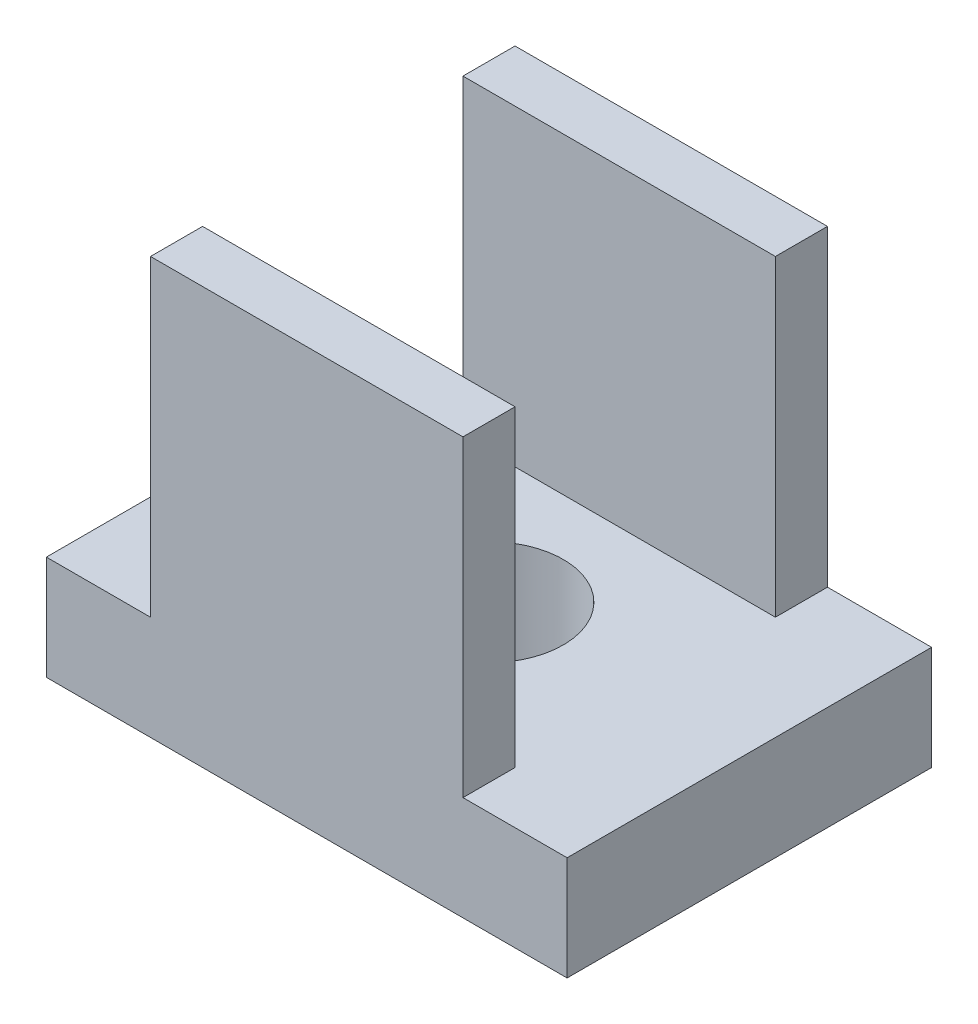
ISO-10303-21;
HEADER;
FILE_DESCRIPTION(('STEP AP214'),'2;1');
FILE_NAME('part.step','',(''),(''),'','','');
FILE_SCHEMA(('AUTOMOTIVE_DESIGN { 1 0 10303 214 1 1 1 1 }'));
ENDSEC;
DATA;
#1=APPLICATION_CONTEXT('core data for automotive mechanical design processes');
#2=APPLICATION_PROTOCOL_DEFINITION('international standard','automotive_design',2000,#1);
#3=PRODUCT_CONTEXT('',#1,'mechanical');
#4=PRODUCT('Part','Part','',(#3));
#5=PRODUCT_RELATED_PRODUCT_CATEGORY('part','',(#4));
#6=PRODUCT_DEFINITION_FORMATION('','',#4);
#7=PRODUCT_DEFINITION_CONTEXT('part definition',#1,'design');
#8=PRODUCT_DEFINITION('design','',#6,#7);
#9=PRODUCT_DEFINITION_SHAPE('','',#8);
#10=(LENGTH_UNIT() NAMED_UNIT(*) SI_UNIT(.MILLI.,.METRE.));
#11=(NAMED_UNIT(*) PLANE_ANGLE_UNIT() SI_UNIT($,.RADIAN.));
#12=(NAMED_UNIT(*) SI_UNIT($,.STERADIAN.) SOLID_ANGLE_UNIT());
#13=UNCERTAINTY_MEASURE_WITH_UNIT(LENGTH_MEASURE(1.E-05),#10,'distance_accuracy_value','');
#14=(GEOMETRIC_REPRESENTATION_CONTEXT(3) GLOBAL_UNCERTAINTY_ASSIGNED_CONTEXT((#13)) GLOBAL_UNIT_ASSIGNED_CONTEXT((#10,
#11,#12)) REPRESENTATION_CONTEXT('',''));
#15=CARTESIAN_POINT('',(0.,0.,0.));
#16=DIRECTION('',(0.,0.,1.));
#17=DIRECTION('',(1.,0.,0.));
#18=AXIS2_PLACEMENT_3D('',#15,#16,#17);
#19=CARTESIAN_POINT('',(0.,2.,0.));
#20=DIRECTION('',(0.,-1.,0.));
#21=DIRECTION('',(0.,0.,-1.));
#22=AXIS2_PLACEMENT_3D('',#19,#20,#21);
#23=PLANE('',#22);
#24=CARTESIAN_POINT('',(0.,2.,0.));
#25=DIRECTION('',(0.,1.,0.));
#26=DIRECTION('',(0.,0.,1.));
#27=AXIS2_PLACEMENT_3D('',#24,#25,#26);
#28=CIRCLE('',#27,1.425);
#29=CARTESIAN_POINT('',(0.,2.,1.425));
#30=VERTEX_POINT('',#29);
#31=EDGE_CURVE('E200',#30,#30,#28,.T.);
#32=ORIENTED_EDGE('',*,*,#31,.F.);
#33=EDGE_LOOP('',(#32));
#34=FACE_BOUND('',#33,.T.);
#35=DIRECTION('',(0.,0.,-1.));
#36=VECTOR('',#35,1.);
#37=CARTESIAN_POINT('',(3.,2.,-3.5));
#38=LINE('',#37,#36);
#39=CARTESIAN_POINT('',(3.,2.,-2.5));
#40=VERTEX_POINT('',#39);
#41=CARTESIAN_POINT('',(3.,2.,-3.5));
#42=VERTEX_POINT('',#41);
#43=EDGE_CURVE('E56',#40,#42,#38,.T.);
#44=ORIENTED_EDGE('',*,*,#43,.F.);
#45=DIRECTION('',(1.,0.,0.));
#46=VECTOR('',#45,1.);
#47=CARTESIAN_POINT('',(3.,2.,-2.5));
#48=LINE('',#47,#46);
#49=CARTESIAN_POINT('',(-3.,2.,-2.5));
#50=VERTEX_POINT('',#49);
#51=EDGE_CURVE('E60',#50,#40,#48,.T.);
#52=ORIENTED_EDGE('',*,*,#51,.F.);
#53=DIRECTION('',(0.,0.,1.));
#54=VECTOR('',#53,1.);
#55=CARTESIAN_POINT('',(-3.,2.,-3.5));
#56=LINE('',#55,#54);
#57=CARTESIAN_POINT('',(-3.,2.,-3.5));
#58=VERTEX_POINT('',#57);
#59=EDGE_CURVE('E412',#58,#50,#56,.T.);
#60=ORIENTED_EDGE('',*,*,#59,.F.);
#61=DIRECTION('',(-1.,0.,0.));
#62=VECTOR('',#61,1.);
#63=CARTESIAN_POINT('',(-5.,2.,-3.5));
#64=LINE('',#63,#62);
#65=CARTESIAN_POINT('',(-5.,2.,-3.5));
#66=VERTEX_POINT('',#65);
#67=EDGE_CURVE('E208',#58,#66,#64,.T.);
#68=ORIENTED_EDGE('',*,*,#67,.T.);
#69=DIRECTION('',(0.,0.,1.));
#70=VECTOR('',#69,1.);
#71=CARTESIAN_POINT('',(-5.,2.,3.5));
#72=LINE('',#71,#70);
#73=CARTESIAN_POINT('',(-5.,2.,3.5));
#74=VERTEX_POINT('',#73);
#75=EDGE_CURVE('E213',#66,#74,#72,.T.);
#76=ORIENTED_EDGE('',*,*,#75,.T.);
#77=DIRECTION('',(1.,0.,0.));
#78=VECTOR('',#77,1.);
#79=CARTESIAN_POINT('',(-5.,2.,3.5));
#80=LINE('',#79,#78);
#81=CARTESIAN_POINT('',(-3.,2.,3.5));
#82=VERTEX_POINT('',#81);
#83=EDGE_CURVE('E217',#74,#82,#80,.T.);
#84=ORIENTED_EDGE('',*,*,#83,.T.);
#85=DIRECTION('',(0.,0.,1.));
#86=VECTOR('',#85,1.);
#87=CARTESIAN_POINT('',(-3.,2.,3.5));
#88=LINE('',#87,#86);
#89=CARTESIAN_POINT('',(-3.,2.,2.5));
#90=VERTEX_POINT('',#89);
#91=EDGE_CURVE('E169',#90,#82,#88,.T.);
#92=ORIENTED_EDGE('',*,*,#91,.F.);
#93=DIRECTION('',(-1.,0.,0.));
#94=VECTOR('',#93,1.);
#95=CARTESIAN_POINT('',(3.,2.,2.5));
#96=LINE('',#95,#94);
#97=CARTESIAN_POINT('',(3.,2.,2.5));
#98=VERTEX_POINT('',#97);
#99=EDGE_CURVE('E158',#98,#90,#96,.T.);
#100=ORIENTED_EDGE('',*,*,#99,.F.);
#101=DIRECTION('',(0.,0.,-1.));
#102=VECTOR('',#101,1.);
#103=CARTESIAN_POINT('',(3.,2.,3.5));
#104=LINE('',#103,#102);
#105=CARTESIAN_POINT('',(3.,2.,3.5));
#106=VERTEX_POINT('',#105);
#107=EDGE_CURVE('E153',#106,#98,#104,.T.);
#108=ORIENTED_EDGE('',*,*,#107,.F.);
#109=CARTESIAN_POINT('',(5.,2.,3.5));
#110=VERTEX_POINT('',#109);
#111=EDGE_CURVE('E216',#106,#110,#80,.T.);
#112=ORIENTED_EDGE('',*,*,#111,.T.);
#113=DIRECTION('',(0.,0.,-1.));
#114=VECTOR('',#113,1.);
#115=CARTESIAN_POINT('',(5.,2.,3.5));
#116=LINE('',#115,#114);
#117=CARTESIAN_POINT('',(5.,2.,-3.5));
#118=VERTEX_POINT('',#117);
#119=EDGE_CURVE('E204',#110,#118,#116,.T.);
#120=ORIENTED_EDGE('',*,*,#119,.T.);
#121=EDGE_CURVE('E210',#118,#42,#64,.T.);
#122=ORIENTED_EDGE('',*,*,#121,.T.);
#123=EDGE_LOOP('',(#44,#52,#60,#68,#76,#84,#92,#100,#108,#112,#120,#122));
#124=FACE_BOUND('',#123,.T.);
#125=ADVANCED_FACE('F39',(#34,#124),#23,.F.);
#126=CARTESIAN_POINT('',(5.,2.,3.5));
#127=DIRECTION('',(-1.,0.,0.));
#128=DIRECTION('',(0.,0.,1.));
#129=AXIS2_PLACEMENT_3D('',#126,#127,#128);
#130=PLANE('',#129);
#131=DIRECTION('',(0.,0.,-1.));
#132=VECTOR('',#131,1.);
#133=CARTESIAN_POINT('',(5.,0.,3.5));
#134=LINE('',#133,#132);
#135=CARTESIAN_POINT('',(5.,0.,3.5));
#136=VERTEX_POINT('',#135);
#137=CARTESIAN_POINT('',(5.,0.,-3.5));
#138=VERTEX_POINT('',#137);
#139=EDGE_CURVE('E221',#136,#138,#134,.T.);
#140=ORIENTED_EDGE('',*,*,#139,.T.);
#141=DIRECTION('',(0.,-1.,0.));
#142=VECTOR('',#141,1.);
#143=CARTESIAN_POINT('',(5.,2.,-3.5));
#144=LINE('',#143,#142);
#145=EDGE_CURVE('E11',#118,#138,#144,.T.);
#146=ORIENTED_EDGE('',*,*,#145,.F.);
#147=ORIENTED_EDGE('',*,*,#119,.F.);
#148=DIRECTION('',(0.,-1.,0.));
#149=VECTOR('',#148,1.);
#150=CARTESIAN_POINT('',(5.,2.,3.5));
#151=LINE('',#150,#149);
#152=EDGE_CURVE('E220',#110,#136,#151,.T.);
#153=ORIENTED_EDGE('',*,*,#152,.T.);
#154=EDGE_LOOP('',(#140,#146,#147,#153));
#155=FACE_BOUND('',#154,.T.);
#156=ADVANCED_FACE('F41',(#155),#130,.F.);
#157=CARTESIAN_POINT('',(-5.,2.,-3.5));
#158=DIRECTION('',(0.,0.,1.));
#159=DIRECTION('',(1.,0.,0.));
#160=AXIS2_PLACEMENT_3D('',#157,#158,#159);
#161=PLANE('',#160);
#162=DIRECTION('',(-1.,0.,0.));
#163=VECTOR('',#162,1.);
#164=CARTESIAN_POINT('',(-5.,0.,-3.5));
#165=LINE('',#164,#163);
#166=CARTESIAN_POINT('',(-5.,0.,-3.5));
#167=VERTEX_POINT('',#166);
#168=EDGE_CURVE('E225',#138,#167,#165,.T.);
#169=ORIENTED_EDGE('',*,*,#168,.T.);
#170=DIRECTION('',(0.,-1.,0.));
#171=VECTOR('',#170,1.);
#172=CARTESIAN_POINT('',(-5.,2.,-3.5));
#173=LINE('',#172,#171);
#174=EDGE_CURVE('E49',#66,#167,#173,.T.);
#175=ORIENTED_EDGE('',*,*,#174,.F.);
#176=ORIENTED_EDGE('',*,*,#67,.F.);
#177=DIRECTION('',(0.,-1.,0.));
#178=VECTOR('',#177,1.);
#179=CARTESIAN_POINT('',(-3.,8.,-3.5));
#180=LINE('',#179,#178);
#181=CARTESIAN_POINT('',(-3.,8.,-3.5));
#182=VERTEX_POINT('',#181);
#183=EDGE_CURVE('E135',#182,#58,#180,.T.);
#184=ORIENTED_EDGE('',*,*,#183,.F.);
#185=DIRECTION('',(-1.,0.,0.));
#186=VECTOR('',#185,1.);
#187=CARTESIAN_POINT('',(-3.,8.,-3.5));
#188=LINE('',#187,#186);
#189=CARTESIAN_POINT('',(3.,8.,-3.5));
#190=VERTEX_POINT('',#189);
#191=EDGE_CURVE('E129',#190,#182,#188,.T.);
#192=ORIENTED_EDGE('',*,*,#191,.F.);
#193=DIRECTION('',(0.,-1.,0.));
#194=VECTOR('',#193,1.);
#195=CARTESIAN_POINT('',(3.,8.,-3.5));
#196=LINE('',#195,#194);
#197=EDGE_CURVE('E133',#190,#42,#196,.T.);
#198=ORIENTED_EDGE('',*,*,#197,.T.);
#199=ORIENTED_EDGE('',*,*,#121,.F.);
#200=ORIENTED_EDGE('',*,*,#145,.T.);
#201=EDGE_LOOP('',(#169,#175,#176,#184,#192,#198,#199,#200));
#202=FACE_BOUND('',#201,.T.);
#203=ADVANCED_FACE('F131',(#202),#161,.F.);
#204=CARTESIAN_POINT('',(-5.,2.,3.5));
#205=DIRECTION('',(1.,0.,0.));
#206=DIRECTION('',(0.,0.,-1.));
#207=AXIS2_PLACEMENT_3D('',#204,#205,#206);
#208=PLANE('',#207);
#209=DIRECTION('',(0.,0.,1.));
#210=VECTOR('',#209,1.);
#211=CARTESIAN_POINT('',(-5.,0.,3.5));
#212=LINE('',#211,#210);
#213=CARTESIAN_POINT('',(-5.,0.,3.5));
#214=VERTEX_POINT('',#213);
#215=EDGE_CURVE('E228',#167,#214,#212,.T.);
#216=ORIENTED_EDGE('',*,*,#215,.T.);
#217=DIRECTION('',(0.,-1.,0.));
#218=VECTOR('',#217,1.);
#219=CARTESIAN_POINT('',(-5.,2.,3.5));
#220=LINE('',#219,#218);
#221=EDGE_CURVE('E236',#74,#214,#220,.T.);
#222=ORIENTED_EDGE('',*,*,#221,.F.);
#223=ORIENTED_EDGE('',*,*,#75,.F.);
#224=ORIENTED_EDGE('',*,*,#174,.T.);
#225=EDGE_LOOP('',(#216,#222,#223,#224));
#226=FACE_BOUND('',#225,.T.);
#227=ADVANCED_FACE('F246',(#226),#208,.F.);
#228=CARTESIAN_POINT('',(-5.,2.,3.5));
#229=DIRECTION('',(0.,0.,-1.));
#230=DIRECTION('',(-1.,0.,0.));
#231=AXIS2_PLACEMENT_3D('',#228,#229,#230);
#232=PLANE('',#231);
#233=DIRECTION('',(1.,0.,0.));
#234=VECTOR('',#233,1.);
#235=CARTESIAN_POINT('',(-5.,0.,3.5));
#236=LINE('',#235,#234);
#237=EDGE_CURVE('E209',#214,#136,#236,.T.);
#238=ORIENTED_EDGE('',*,*,#237,.T.);
#239=ORIENTED_EDGE('',*,*,#152,.F.);
#240=ORIENTED_EDGE('',*,*,#111,.F.);
#241=DIRECTION('',(0.,-1.,0.));
#242=VECTOR('',#241,1.);
#243=CARTESIAN_POINT('',(3.,8.,3.5));
#244=LINE('',#243,#242);
#245=CARTESIAN_POINT('',(3.,8.,3.5));
#246=VERTEX_POINT('',#245);
#247=EDGE_CURVE('E196',#246,#106,#244,.T.);
#248=ORIENTED_EDGE('',*,*,#247,.F.);
#249=DIRECTION('',(1.,0.,0.));
#250=VECTOR('',#249,1.);
#251=CARTESIAN_POINT('',(-3.,8.,3.5));
#252=LINE('',#251,#250);
#253=CARTESIAN_POINT('',(-3.,8.,3.5));
#254=VERTEX_POINT('',#253);
#255=EDGE_CURVE('E164',#254,#246,#252,.T.);
#256=ORIENTED_EDGE('',*,*,#255,.F.);
#257=DIRECTION('',(0.,-1.,0.));
#258=VECTOR('',#257,1.);
#259=CARTESIAN_POINT('',(-3.,8.,3.5));
#260=LINE('',#259,#258);
#261=EDGE_CURVE('E177',#254,#82,#260,.T.);
#262=ORIENTED_EDGE('',*,*,#261,.T.);
#263=ORIENTED_EDGE('',*,*,#83,.F.);
#264=ORIENTED_EDGE('',*,*,#221,.T.);
#265=EDGE_LOOP('',(#238,#239,#240,#248,#256,#262,#263,#264));
#266=FACE_BOUND('',#265,.T.);
#267=ADVANCED_FACE('F254',(#266),#232,.F.);
#268=CARTESIAN_POINT('',(0.,0.,0.));
#269=DIRECTION('',(0.,-1.,0.));
#270=DIRECTION('',(0.,0.,-1.));
#271=AXIS2_PLACEMENT_3D('',#268,#269,#270);
#272=PLANE('',#271);
#273=CARTESIAN_POINT('',(0.,0.,0.));
#274=DIRECTION('',(0.,-1.,0.));
#275=DIRECTION('',(0.,0.,-1.));
#276=AXIS2_PLACEMENT_3D('',#273,#274,#275);
#277=CIRCLE('',#276,1.425);
#278=CARTESIAN_POINT('',(0.,0.,-1.425));
#279=VERTEX_POINT('',#278);
#280=EDGE_CURVE('E43',#279,#279,#277,.T.);
#281=ORIENTED_EDGE('',*,*,#280,.F.);
#282=EDGE_LOOP('',(#281));
#283=FACE_BOUND('',#282,.T.);
#284=ORIENTED_EDGE('',*,*,#139,.F.);
#285=ORIENTED_EDGE('',*,*,#237,.F.);
#286=ORIENTED_EDGE('',*,*,#215,.F.);
#287=ORIENTED_EDGE('',*,*,#168,.F.);
#288=EDGE_LOOP('',(#284,#285,#286,#287));
#289=FACE_BOUND('',#288,.T.);
#290=ADVANCED_FACE('F251',(#283,#289),#272,.T.);
#291=CARTESIAN_POINT('',(0.,-13.,0.));
#292=DIRECTION('',(0.,1.,0.));
#293=DIRECTION('',(0.,0.,1.));
#294=AXIS2_PLACEMENT_3D('',#291,#292,#293);
#295=CYLINDRICAL_SURFACE('',#294,1.425);
#296=ORIENTED_EDGE('',*,*,#280,.T.);
#297=EDGE_LOOP('',(#296));
#298=FACE_BOUND('',#297,.T.);
#299=ORIENTED_EDGE('',*,*,#31,.T.);
#300=EDGE_LOOP('',(#299));
#301=FACE_BOUND('',#300,.T.);
#302=ADVANCED_FACE('F267',(#298,#301),#295,.F.);
#303=CARTESIAN_POINT('',(3.,8.,3.5));
#304=DIRECTION('',(-1.,0.,0.));
#305=DIRECTION('',(0.,0.,1.));
#306=AXIS2_PLACEMENT_3D('',#303,#304,#305);
#307=PLANE('',#306);
#308=ORIENTED_EDGE('',*,*,#107,.T.);
#309=DIRECTION('',(0.,-1.,0.));
#310=VECTOR('',#309,1.);
#311=CARTESIAN_POINT('',(3.,8.,2.5));
#312=LINE('',#311,#310);
#313=CARTESIAN_POINT('',(3.,8.,2.5));
#314=VERTEX_POINT('',#313);
#315=EDGE_CURVE('E192',#314,#98,#312,.T.);
#316=ORIENTED_EDGE('',*,*,#315,.F.);
#317=DIRECTION('',(0.,0.,-1.));
#318=VECTOR('',#317,1.);
#319=CARTESIAN_POINT('',(3.,8.,3.5));
#320=LINE('',#319,#318);
#321=EDGE_CURVE('E168',#246,#314,#320,.T.);
#322=ORIENTED_EDGE('',*,*,#321,.F.);
#323=ORIENTED_EDGE('',*,*,#247,.T.);
#324=EDGE_LOOP('',(#308,#316,#322,#323));
#325=FACE_BOUND('',#324,.T.);
#326=ADVANCED_FACE('F276',(#325),#307,.F.);
#327=CARTESIAN_POINT('',(3.,8.,2.5));
#328=DIRECTION('',(0.,0.,1.));
#329=DIRECTION('',(1.,0.,0.));
#330=AXIS2_PLACEMENT_3D('',#327,#328,#329);
#331=PLANE('',#330);
#332=ORIENTED_EDGE('',*,*,#99,.T.);
#333=DIRECTION('',(0.,-1.,0.));
#334=VECTOR('',#333,1.);
#335=CARTESIAN_POINT('',(-3.,8.,2.5));
#336=LINE('',#335,#334);
#337=CARTESIAN_POINT('',(-3.,8.,2.5));
#338=VERTEX_POINT('',#337);
#339=EDGE_CURVE('E188',#338,#90,#336,.T.);
#340=ORIENTED_EDGE('',*,*,#339,.F.);
#341=DIRECTION('',(-1.,0.,0.));
#342=VECTOR('',#341,1.);
#343=CARTESIAN_POINT('',(3.,8.,2.5));
#344=LINE('',#343,#342);
#345=EDGE_CURVE('E172',#314,#338,#344,.T.);
#346=ORIENTED_EDGE('',*,*,#345,.F.);
#347=ORIENTED_EDGE('',*,*,#315,.T.);
#348=EDGE_LOOP('',(#332,#340,#346,#347));
#349=FACE_BOUND('',#348,.T.);
#350=ADVANCED_FACE('F289',(#349),#331,.F.);
#351=CARTESIAN_POINT('',(-3.,8.,3.5));
#352=DIRECTION('',(1.,0.,0.));
#353=DIRECTION('',(0.,0.,-1.));
#354=AXIS2_PLACEMENT_3D('',#351,#352,#353);
#355=PLANE('',#354);
#356=ORIENTED_EDGE('',*,*,#91,.T.);
#357=ORIENTED_EDGE('',*,*,#261,.F.);
#358=DIRECTION('',(0.,0.,1.));
#359=VECTOR('',#358,1.);
#360=CARTESIAN_POINT('',(-3.,8.,3.5));
#361=LINE('',#360,#359);
#362=EDGE_CURVE('E175',#338,#254,#361,.T.);
#363=ORIENTED_EDGE('',*,*,#362,.F.);
#364=ORIENTED_EDGE('',*,*,#339,.T.);
#365=EDGE_LOOP('',(#356,#357,#363,#364));
#366=FACE_BOUND('',#365,.T.);
#367=ADVANCED_FACE('F293',(#366),#355,.F.);
#368=CARTESIAN_POINT('',(0.,8.,0.));
#369=DIRECTION('',(0.,1.,0.));
#370=DIRECTION('',(0.,0.,1.));
#371=AXIS2_PLACEMENT_3D('',#368,#369,#370);
#372=PLANE('',#371);
#373=ORIENTED_EDGE('',*,*,#255,.T.);
#374=ORIENTED_EDGE('',*,*,#321,.T.);
#375=ORIENTED_EDGE('',*,*,#345,.T.);
#376=ORIENTED_EDGE('',*,*,#362,.T.);
#377=EDGE_LOOP('',(#373,#374,#375,#376));
#378=FACE_BOUND('',#377,.T.);
#379=ADVANCED_FACE('F297',(#378),#372,.T.);
#380=CARTESIAN_POINT('',(3.,8.,-3.5));
#381=DIRECTION('',(-1.,0.,0.));
#382=DIRECTION('',(0.,0.,1.));
#383=AXIS2_PLACEMENT_3D('',#380,#381,#382);
#384=PLANE('',#383);
#385=ORIENTED_EDGE('',*,*,#43,.T.);
#386=ORIENTED_EDGE('',*,*,#197,.F.);
#387=DIRECTION('',(0.,0.,-1.));
#388=VECTOR('',#387,1.);
#389=CARTESIAN_POINT('',(3.,8.,-3.5));
#390=LINE('',#389,#388);
#391=CARTESIAN_POINT('',(3.,8.,-2.5));
#392=VERTEX_POINT('',#391);
#393=EDGE_CURVE('E140',#392,#190,#390,.T.);
#394=ORIENTED_EDGE('',*,*,#393,.F.);
#395=DIRECTION('',(0.,-1.,0.));
#396=VECTOR('',#395,1.);
#397=CARTESIAN_POINT('',(3.,8.,-2.5));
#398=LINE('',#397,#396);
#399=EDGE_CURVE('E409',#392,#40,#398,.T.);
#400=ORIENTED_EDGE('',*,*,#399,.T.);
#401=EDGE_LOOP('',(#385,#386,#394,#400));
#402=FACE_BOUND('',#401,.T.);
#403=ADVANCED_FACE('F151',(#402),#384,.F.);
#404=CARTESIAN_POINT('',(-3.,8.,-3.5));
#405=DIRECTION('',(1.,0.,0.));
#406=DIRECTION('',(0.,0.,-1.));
#407=AXIS2_PLACEMENT_3D('',#404,#405,#406);
#408=PLANE('',#407);
#409=ORIENTED_EDGE('',*,*,#59,.T.);
#410=DIRECTION('',(0.,-1.,0.));
#411=VECTOR('',#410,1.);
#412=CARTESIAN_POINT('',(-3.,8.,-2.5));
#413=LINE('',#412,#411);
#414=CARTESIAN_POINT('',(-3.,8.,-2.5));
#415=VERTEX_POINT('',#414);
#416=EDGE_CURVE('E160',#415,#50,#413,.T.);
#417=ORIENTED_EDGE('',*,*,#416,.F.);
#418=DIRECTION('',(0.,0.,1.));
#419=VECTOR('',#418,1.);
#420=CARTESIAN_POINT('',(-3.,8.,-3.5));
#421=LINE('',#420,#419);
#422=EDGE_CURVE('E139',#182,#415,#421,.T.);
#423=ORIENTED_EDGE('',*,*,#422,.F.);
#424=ORIENTED_EDGE('',*,*,#183,.T.);
#425=EDGE_LOOP('',(#409,#417,#423,#424));
#426=FACE_BOUND('',#425,.T.);
#427=ADVANCED_FACE('F304',(#426),#408,.F.);
#428=CARTESIAN_POINT('',(3.,8.,-2.5));
#429=DIRECTION('',(0.,0.,-1.));
#430=DIRECTION('',(-1.,0.,0.));
#431=AXIS2_PLACEMENT_3D('',#428,#429,#430);
#432=PLANE('',#431);
#433=ORIENTED_EDGE('',*,*,#51,.T.);
#434=ORIENTED_EDGE('',*,*,#399,.F.);
#435=DIRECTION('',(1.,0.,0.));
#436=VECTOR('',#435,1.);
#437=CARTESIAN_POINT('',(3.,8.,-2.5));
#438=LINE('',#437,#436);
#439=EDGE_CURVE('E145',#415,#392,#438,.T.);
#440=ORIENTED_EDGE('',*,*,#439,.F.);
#441=ORIENTED_EDGE('',*,*,#416,.T.);
#442=EDGE_LOOP('',(#433,#434,#440,#441));
#443=FACE_BOUND('',#442,.T.);
#444=ADVANCED_FACE('F307',(#443),#432,.F.);
#445=CARTESIAN_POINT('',(0.,8.,0.));
#446=DIRECTION('',(0.,-1.,0.));
#447=DIRECTION('',(0.,0.,-1.));
#448=AXIS2_PLACEMENT_3D('',#445,#446,#447);
#449=PLANE('',#448);
#450=ORIENTED_EDGE('',*,*,#393,.T.);
#451=ORIENTED_EDGE('',*,*,#191,.T.);
#452=ORIENTED_EDGE('',*,*,#422,.T.);
#453=ORIENTED_EDGE('',*,*,#439,.T.);
#454=EDGE_LOOP('',(#450,#451,#452,#453));
#455=FACE_BOUND('',#454,.T.);
#456=ADVANCED_FACE('F143',(#455),#449,.F.);
#457=CLOSED_SHELL('',(#125,#156,#203,#227,#267,#290,#302,#326,#350,#367,#379,#403,#427,#444,#456));
#458=MANIFOLD_SOLID_BREP('B2',#457);
#459=ADVANCED_BREP_SHAPE_REPRESENTATION('',(#18,#458),#14);
#460=SHAPE_DEFINITION_REPRESENTATION(#9,#459);
ENDSEC;
END-ISO-10303-21;
